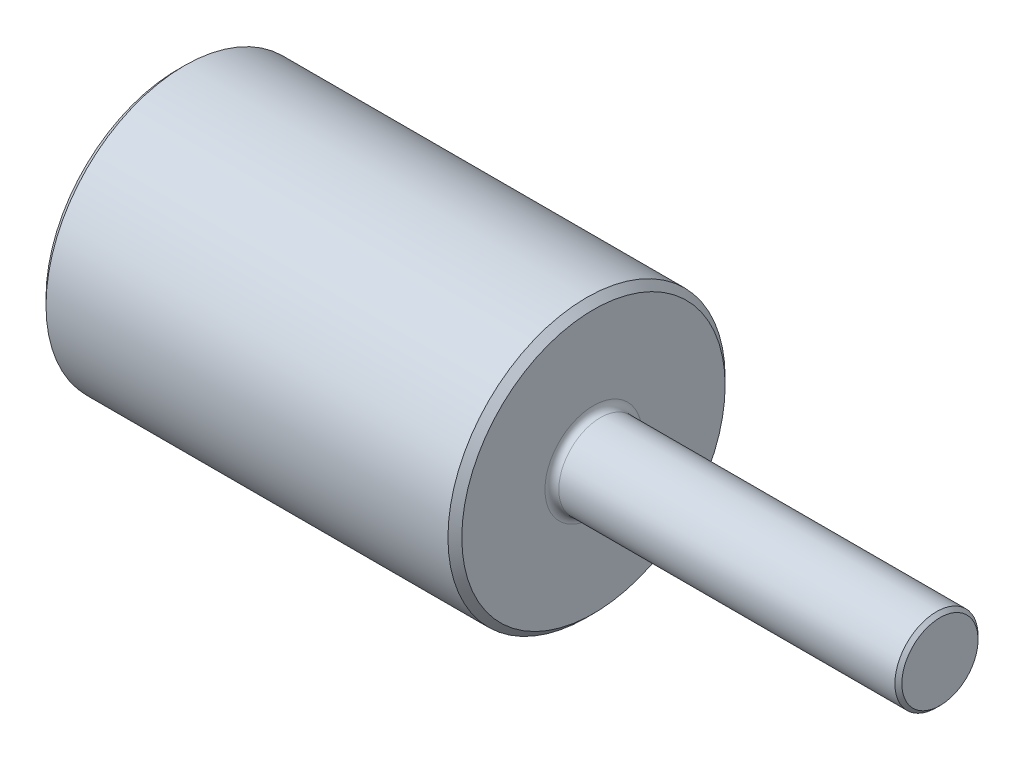
ISO-10303-21;
HEADER;
FILE_DESCRIPTION(('STEP AP214'),'2;1');
FILE_NAME('part.step','',(''),(''),'','','');
FILE_SCHEMA(('AUTOMOTIVE_DESIGN { 1 0 10303 214 1 1 1 1 }'));
ENDSEC;
DATA;
#1=APPLICATION_CONTEXT('core data for automotive mechanical design processes');
#2=APPLICATION_PROTOCOL_DEFINITION('international standard','automotive_design',2000,#1);
#3=PRODUCT_CONTEXT('',#1,'mechanical');
#4=PRODUCT('Part','Part','',(#3));
#5=PRODUCT_RELATED_PRODUCT_CATEGORY('part','',(#4));
#6=PRODUCT_DEFINITION_FORMATION('','',#4);
#7=PRODUCT_DEFINITION_CONTEXT('part definition',#1,'design');
#8=PRODUCT_DEFINITION('design','',#6,#7);
#9=PRODUCT_DEFINITION_SHAPE('','',#8);
#10=(LENGTH_UNIT() NAMED_UNIT(*) SI_UNIT(.MILLI.,.METRE.));
#11=(NAMED_UNIT(*) PLANE_ANGLE_UNIT() SI_UNIT($,.RADIAN.));
#12=(NAMED_UNIT(*) SI_UNIT($,.STERADIAN.) SOLID_ANGLE_UNIT());
#13=UNCERTAINTY_MEASURE_WITH_UNIT(LENGTH_MEASURE(1.E-05),#10,'distance_accuracy_value','');
#14=(GEOMETRIC_REPRESENTATION_CONTEXT(3) GLOBAL_UNCERTAINTY_ASSIGNED_CONTEXT((#13)) GLOBAL_UNIT_ASSIGNED_CONTEXT((#10,
#11,#12)) REPRESENTATION_CONTEXT('',''));
#15=CARTESIAN_POINT('',(0.,0.,0.));
#16=DIRECTION('',(0.,0.,1.));
#17=DIRECTION('',(1.,0.,0.));
#18=AXIS2_PLACEMENT_3D('',#15,#16,#17);
#19=CARTESIAN_POINT('',(0.,0.,0.));
#20=DIRECTION('',(-1.,0.,0.));
#21=DIRECTION('',(0.,0.,1.));
#22=AXIS2_PLACEMENT_3D('',#19,#20,#21);
#23=PLANE('',#22);
#24=CARTESIAN_POINT('',(0.,0.,0.));
#25=DIRECTION('',(-1.,0.,0.));
#26=DIRECTION('',(0.,0.,1.));
#27=AXIS2_PLACEMENT_3D('',#24,#25,#26);
#28=CIRCLE('',#27,2.74999999999999);
#29=CARTESIAN_POINT('',(0.,0.,2.74999999999999));
#30=VERTEX_POINT('',#29);
#31=EDGE_CURVE('E55',#30,#30,#28,.F.);
#32=ORIENTED_EDGE('',*,*,#31,.T.);
#33=EDGE_LOOP('',(#32));
#34=FACE_BOUND('',#33,.T.);
#35=ADVANCED_FACE('F30',(#34),#23,.F.);
#36=CARTESIAN_POINT('',(-58.6699153684107,0.,0.));
#37=DIRECTION('',(-1.,0.,0.));
#38=DIRECTION('',(0.,0.,1.));
#39=AXIS2_PLACEMENT_3D('',#36,#37,#38);
#40=CYLINDRICAL_SURFACE('',#39,3.);
#41=CARTESIAN_POINT('',(-24.5,0.,0.));
#42=DIRECTION('',(-1.,0.,0.));
#43=DIRECTION('',(0.,0.,1.));
#44=AXIS2_PLACEMENT_3D('',#41,#42,#43);
#45=CIRCLE('',#44,3.);
#46=CARTESIAN_POINT('',(-24.5,0.,3.));
#47=VERTEX_POINT('',#46);
#48=EDGE_CURVE('E10',#47,#47,#45,.F.);
#49=ORIENTED_EDGE('',*,*,#48,.T.);
#50=EDGE_LOOP('',(#49));
#51=FACE_BOUND('',#50,.T.);
#52=CARTESIAN_POINT('',(-0.250000000000003,0.,0.));
#53=DIRECTION('',(-1.,0.,0.));
#54=DIRECTION('',(0.,0.,1.));
#55=AXIS2_PLACEMENT_3D('',#52,#53,#54);
#56=CIRCLE('',#55,3.);
#57=CARTESIAN_POINT('',(-0.250000000000003,0.,3.));
#58=VERTEX_POINT('',#57);
#59=EDGE_CURVE('E58',#58,#58,#56,.T.);
#60=ORIENTED_EDGE('',*,*,#59,.T.);
#61=EDGE_LOOP('',(#60));
#62=FACE_BOUND('',#61,.T.);
#63=ADVANCED_FACE('F62',(#51,#62),#40,.T.);
#64=CARTESIAN_POINT('',(-25.,3.,0.));
#65=DIRECTION('',(-1.,0.,0.));
#66=DIRECTION('',(0.,0.,1.));
#67=AXIS2_PLACEMENT_3D('',#64,#65,#66);
#68=PLANE('',#67);
#69=CARTESIAN_POINT('',(-25.,0.,0.));
#70=DIRECTION('',(-1.,0.,0.));
#71=DIRECTION('',(0.,0.,1.));
#72=AXIS2_PLACEMENT_3D('',#69,#70,#71);
#73=CIRCLE('',#72,3.5);
#74=CARTESIAN_POINT('',(-25.,0.,3.5));
#75=VERTEX_POINT('',#74);
#76=EDGE_CURVE('E36',#75,#75,#73,.T.);
#77=ORIENTED_EDGE('',*,*,#76,.T.);
#78=EDGE_LOOP('',(#77));
#79=FACE_BOUND('',#78,.T.);
#80=CARTESIAN_POINT('',(-25.,0.,0.));
#81=DIRECTION('',(-1.,0.,0.));
#82=DIRECTION('',(0.,0.,1.));
#83=AXIS2_PLACEMENT_3D('',#80,#81,#82);
#84=CIRCLE('',#83,9.5);
#85=CARTESIAN_POINT('',(-25.,0.,9.5));
#86=VERTEX_POINT('',#85);
#87=EDGE_CURVE('E44',#86,#86,#84,.F.);
#88=ORIENTED_EDGE('',*,*,#87,.T.);
#89=EDGE_LOOP('',(#88));
#90=FACE_BOUND('',#89,.T.);
#91=ADVANCED_FACE('F86',(#79,#90),#68,.F.);
#92=CARTESIAN_POINT('',(-58.6699153684107,0.,0.));
#93=DIRECTION('',(-1.,0.,0.));
#94=DIRECTION('',(0.,0.,1.));
#95=AXIS2_PLACEMENT_3D('',#92,#93,#94);
#96=CYLINDRICAL_SURFACE('',#95,10.);
#97=CARTESIAN_POINT('',(-25.5,0.,0.));
#98=DIRECTION('',(-1.,0.,0.));
#99=DIRECTION('',(0.,0.,1.));
#100=AXIS2_PLACEMENT_3D('',#97,#98,#99);
#101=CIRCLE('',#100,10.);
#102=CARTESIAN_POINT('',(-25.5,0.,10.));
#103=VERTEX_POINT('',#102);
#104=EDGE_CURVE('E49',#103,#103,#101,.T.);
#105=ORIENTED_EDGE('',*,*,#104,.T.);
#106=EDGE_LOOP('',(#105));
#107=FACE_BOUND('',#106,.T.);
#108=CARTESIAN_POINT('',(-54.5,0.,0.));
#109=DIRECTION('',(1.,0.,0.));
#110=DIRECTION('',(0.,0.,-1.));
#111=AXIS2_PLACEMENT_3D('',#108,#109,#110);
#112=CIRCLE('',#111,10.);
#113=CARTESIAN_POINT('',(-54.5,0.,-10.));
#114=VERTEX_POINT('',#113);
#115=EDGE_CURVE('E52',#114,#114,#112,.T.);
#116=ORIENTED_EDGE('',*,*,#115,.T.);
#117=EDGE_LOOP('',(#116));
#118=FACE_BOUND('',#117,.T.);
#119=ADVANCED_FACE('F77',(#107,#118),#96,.T.);
#120=CARTESIAN_POINT('',(-55.,10.,0.));
#121=DIRECTION('',(1.,0.,0.));
#122=DIRECTION('',(0.,0.,-1.));
#123=AXIS2_PLACEMENT_3D('',#120,#121,#122);
#124=PLANE('',#123);
#125=CARTESIAN_POINT('',(-55.,0.,0.));
#126=DIRECTION('',(1.,0.,0.));
#127=DIRECTION('',(0.,0.,-1.));
#128=AXIS2_PLACEMENT_3D('',#125,#126,#127);
#129=CIRCLE('',#128,9.49999999999999);
#130=CARTESIAN_POINT('',(-55.,0.,-9.49999999999999));
#131=VERTEX_POINT('',#130);
#132=EDGE_CURVE('E40',#131,#131,#129,.F.);
#133=ORIENTED_EDGE('',*,*,#132,.T.);
#134=EDGE_LOOP('',(#133));
#135=FACE_BOUND('',#134,.T.);
#136=ADVANCED_FACE('F67',(#135),#124,.F.);
#137=CARTESIAN_POINT('',(-0.250000000000003,0.,0.));
#138=DIRECTION('',(-1.,0.,0.));
#139=DIRECTION('',(0.,0.,1.));
#140=AXIS2_PLACEMENT_3D('',#137,#138,#139);
#141=CONICAL_SURFACE('',#140,3.,0.78539816339745);
#142=ORIENTED_EDGE('',*,*,#31,.F.);
#143=EDGE_LOOP('',(#142));
#144=FACE_BOUND('',#143,.T.);
#145=ORIENTED_EDGE('',*,*,#59,.F.);
#146=EDGE_LOOP('',(#145));
#147=FACE_BOUND('',#146,.T.);
#148=ADVANCED_FACE('F64',(#144,#147),#141,.T.);
#149=CARTESIAN_POINT('',(-25.5,0.,0.));
#150=DIRECTION('',(-1.,0.,0.));
#151=DIRECTION('',(0.,0.,1.));
#152=AXIS2_PLACEMENT_3D('',#149,#150,#151);
#153=CONICAL_SURFACE('',#152,10.,0.785398163397452);
#154=ORIENTED_EDGE('',*,*,#87,.F.);
#155=EDGE_LOOP('',(#154));
#156=FACE_BOUND('',#155,.T.);
#157=ORIENTED_EDGE('',*,*,#104,.F.);
#158=EDGE_LOOP('',(#157));
#159=FACE_BOUND('',#158,.T.);
#160=ADVANCED_FACE('F66',(#156,#159),#153,.T.);
#161=CARTESIAN_POINT('',(-55.,0.,0.));
#162=DIRECTION('',(1.,0.,0.));
#163=DIRECTION('',(0.,0.,-1.));
#164=AXIS2_PLACEMENT_3D('',#161,#162,#163);
#165=CONICAL_SURFACE('',#164,9.49999999999999,0.785398163397452);
#166=ORIENTED_EDGE('',*,*,#115,.F.);
#167=EDGE_LOOP('',(#166));
#168=FACE_BOUND('',#167,.T.);
#169=ORIENTED_EDGE('',*,*,#132,.F.);
#170=EDGE_LOOP('',(#169));
#171=FACE_BOUND('',#170,.T.);
#172=ADVANCED_FACE('F74',(#168,#171),#165,.T.);
#173=CARTESIAN_POINT('',(-24.5,0.,0.));
#174=DIRECTION('',(-1.,0.,0.));
#175=DIRECTION('',(0.,0.,1.));
#176=AXIS2_PLACEMENT_3D('',#173,#174,#175);
#177=TOROIDAL_SURFACE('',#176,3.5,0.5);
#178=ORIENTED_EDGE('',*,*,#48,.F.);
#179=EDGE_LOOP('',(#178));
#180=FACE_BOUND('',#179,.T.);
#181=ORIENTED_EDGE('',*,*,#76,.F.);
#182=EDGE_LOOP('',(#181));
#183=FACE_BOUND('',#182,.T.);
#184=ADVANCED_FACE('F102',(#180,#183),#177,.F.);
#185=CLOSED_SHELL('',(#35,#63,#91,#119,#136,#148,#160,#172,#184));
#186=MANIFOLD_SOLID_BREP('B2',#185);
#187=ADVANCED_BREP_SHAPE_REPRESENTATION('',(#18,#186),#14);
#188=SHAPE_DEFINITION_REPRESENTATION(#9,#187);
ENDSEC;
END-ISO-10303-21;
